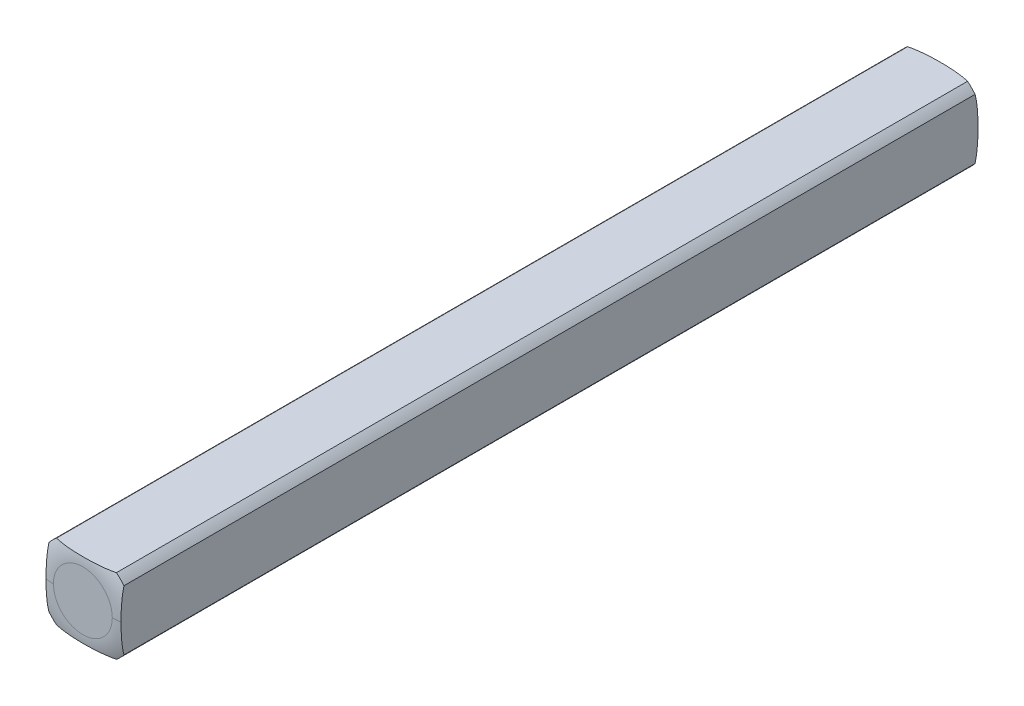
ISO-10303-21;
HEADER;
FILE_DESCRIPTION(('STEP AP214'),'2;1');
FILE_NAME('part.step','',(''),(''),'','','');
FILE_SCHEMA(('AUTOMOTIVE_DESIGN { 1 0 10303 214 1 1 1 1 }'));
ENDSEC;
DATA;
#1=APPLICATION_CONTEXT('core data for automotive mechanical design processes');
#2=APPLICATION_PROTOCOL_DEFINITION('international standard','automotive_design',2000,#1);
#3=PRODUCT_CONTEXT('',#1,'mechanical');
#4=PRODUCT('Part','Part','',(#3));
#5=PRODUCT_RELATED_PRODUCT_CATEGORY('part','',(#4));
#6=PRODUCT_DEFINITION_FORMATION('','',#4);
#7=PRODUCT_DEFINITION_CONTEXT('part definition',#1,'design');
#8=PRODUCT_DEFINITION('design','',#6,#7);
#9=PRODUCT_DEFINITION_SHAPE('','',#8);
#10=(LENGTH_UNIT() NAMED_UNIT(*) SI_UNIT(.MILLI.,.METRE.));
#11=(NAMED_UNIT(*) PLANE_ANGLE_UNIT() SI_UNIT($,.RADIAN.));
#12=(NAMED_UNIT(*) SI_UNIT($,.STERADIAN.) SOLID_ANGLE_UNIT());
#13=UNCERTAINTY_MEASURE_WITH_UNIT(LENGTH_MEASURE(1.E-05),#10,'distance_accuracy_value','');
#14=(GEOMETRIC_REPRESENTATION_CONTEXT(3) GLOBAL_UNCERTAINTY_ASSIGNED_CONTEXT((#13)) GLOBAL_UNIT_ASSIGNED_CONTEXT((#10,
#11,#12)) REPRESENTATION_CONTEXT('',''));
#15=CARTESIAN_POINT('',(0.,0.,0.));
#16=DIRECTION('',(0.,0.,1.));
#17=DIRECTION('',(1.,0.,0.));
#18=AXIS2_PLACEMENT_3D('',#15,#16,#17);
#19=CARTESIAN_POINT('',(0.,0.,-18.161));
#20=DIRECTION('',(0.,0.,1.));
#21=DIRECTION('',(1.,0.,0.));
#22=AXIS2_PLACEMENT_3D('',#19,#20,#21);
#23=CYLINDRICAL_SURFACE('',#22,2.032);
#24=CARTESIAN_POINT('',(0.,0.,-18.009919142098));
#25=DIRECTION('',(0.,0.,1.));
#26=DIRECTION('',(1.,0.,0.));
#27=AXIS2_PLACEMENT_3D('',#24,#25,#26);
#28=CIRCLE('',#27,2.032);
#29=CARTESIAN_POINT('',(-1.26841150657032,1.5875,-18.009919142098));
#30=VERTEX_POINT('',#29);
#31=CARTESIAN_POINT('',(-1.5875,1.26841150657032,-18.009919142098));
#32=VERTEX_POINT('',#31);
#33=EDGE_CURVE('E224',#30,#32,#28,.T.);
#34=ORIENTED_EDGE('',*,*,#33,.T.);
#35=DIRECTION('',(0.,0.,1.));
#36=VECTOR('',#35,1.);
#37=CARTESIAN_POINT('',(-1.5875,1.26841150657032,-18.161));
#38=LINE('',#37,#36);
#39=CARTESIAN_POINT('',(-1.5875,1.26841150657032,18.009919142098));
#40=VERTEX_POINT('',#39);
#41=EDGE_CURVE('E375',#32,#40,#38,.T.);
#42=ORIENTED_EDGE('',*,*,#41,.T.);
#43=CARTESIAN_POINT('',(0.,0.,18.009919142098));
#44=DIRECTION('',(0.,0.,-1.));
#45=DIRECTION('',(-1.,0.,0.));
#46=AXIS2_PLACEMENT_3D('',#43,#44,#45);
#47=CIRCLE('',#46,2.032);
#48=CARTESIAN_POINT('',(-1.26841150657032,1.5875,18.009919142098));
#49=VERTEX_POINT('',#48);
#50=EDGE_CURVE('E9',#40,#49,#47,.T.);
#51=ORIENTED_EDGE('',*,*,#50,.T.);
#52=DIRECTION('',(0.,0.,-1.));
#53=VECTOR('',#52,1.);
#54=CARTESIAN_POINT('',(-1.26841150657032,1.5875,-18.161));
#55=LINE('',#54,#53);
#56=EDGE_CURVE('E523',#49,#30,#55,.T.);
#57=ORIENTED_EDGE('',*,*,#56,.T.);
#58=EDGE_LOOP('',(#34,#42,#51,#57));
#59=FACE_BOUND('',#58,.T.);
#60=ADVANCED_FACE('F15',(#59),#23,.T.);
#61=CARTESIAN_POINT('',(0.,0.,-18.161));
#62=DIRECTION('',(0.,0.,1.));
#63=DIRECTION('',(1.,0.,0.));
#64=AXIS2_PLACEMENT_3D('',#61,#62,#63);
#65=CYLINDRICAL_SURFACE('',#64,2.032);
#66=CARTESIAN_POINT('',(0.,0.,-18.009919142098));
#67=DIRECTION('',(0.,0.,1.));
#68=DIRECTION('',(1.,0.,0.));
#69=AXIS2_PLACEMENT_3D('',#66,#67,#68);
#70=CIRCLE('',#69,2.032);
#71=CARTESIAN_POINT('',(1.5875,1.26841150657032,-18.009919142098));
#72=VERTEX_POINT('',#71);
#73=CARTESIAN_POINT('',(1.26841150657032,1.5875,-18.009919142098));
#74=VERTEX_POINT('',#73);
#75=EDGE_CURVE('E430',#72,#74,#70,.T.);
#76=ORIENTED_EDGE('',*,*,#75,.T.);
#77=DIRECTION('',(0.,0.,1.));
#78=VECTOR('',#77,1.);
#79=CARTESIAN_POINT('',(1.26841150657032,1.5875,-18.161));
#80=LINE('',#79,#78);
#81=CARTESIAN_POINT('',(1.26841150657032,1.5875,18.009919142098));
#82=VERTEX_POINT('',#81);
#83=EDGE_CURVE('E517',#74,#82,#80,.T.);
#84=ORIENTED_EDGE('',*,*,#83,.T.);
#85=CARTESIAN_POINT('',(0.,0.,18.009919142098));
#86=DIRECTION('',(0.,0.,-1.));
#87=DIRECTION('',(-1.,0.,0.));
#88=AXIS2_PLACEMENT_3D('',#85,#86,#87);
#89=CIRCLE('',#88,2.032);
#90=CARTESIAN_POINT('',(1.5875,1.26841150657032,18.009919142098));
#91=VERTEX_POINT('',#90);
#92=EDGE_CURVE('E27',#82,#91,#89,.T.);
#93=ORIENTED_EDGE('',*,*,#92,.T.);
#94=DIRECTION('',(0.,0.,-1.));
#95=VECTOR('',#94,1.);
#96=CARTESIAN_POINT('',(1.5875,1.26841150657032,-18.161));
#97=LINE('',#96,#95);
#98=EDGE_CURVE('E484',#91,#72,#97,.T.);
#99=ORIENTED_EDGE('',*,*,#98,.T.);
#100=EDGE_LOOP('',(#76,#84,#93,#99));
#101=FACE_BOUND('',#100,.T.);
#102=ADVANCED_FACE('F464',(#101),#65,.T.);
#103=CARTESIAN_POINT('',(0.,0.,-18.161));
#104=DIRECTION('',(0.,0.,1.));
#105=DIRECTION('',(1.,0.,0.));
#106=AXIS2_PLACEMENT_3D('',#103,#104,#105);
#107=CYLINDRICAL_SURFACE('',#106,2.032);
#108=CARTESIAN_POINT('',(0.,0.,-18.009919142098));
#109=DIRECTION('',(0.,0.,1.));
#110=DIRECTION('',(1.,0.,0.));
#111=AXIS2_PLACEMENT_3D('',#108,#109,#110);
#112=CIRCLE('',#111,2.032);
#113=CARTESIAN_POINT('',(1.26841150657032,-1.5875,-18.009919142098));
#114=VERTEX_POINT('',#113);
#115=CARTESIAN_POINT('',(1.5875,-1.26841150657032,-18.009919142098));
#116=VERTEX_POINT('',#115);
#117=EDGE_CURVE('E173',#114,#116,#112,.T.);
#118=ORIENTED_EDGE('',*,*,#117,.T.);
#119=DIRECTION('',(0.,0.,1.));
#120=VECTOR('',#119,1.);
#121=CARTESIAN_POINT('',(1.5875,-1.26841150657032,-18.161));
#122=LINE('',#121,#120);
#123=CARTESIAN_POINT('',(1.5875,-1.26841150657032,18.009919142098));
#124=VERTEX_POINT('',#123);
#125=EDGE_CURVE('E348',#116,#124,#122,.T.);
#126=ORIENTED_EDGE('',*,*,#125,.T.);
#127=CARTESIAN_POINT('',(0.,0.,18.009919142098));
#128=DIRECTION('',(0.,0.,-1.));
#129=DIRECTION('',(-1.,0.,0.));
#130=AXIS2_PLACEMENT_3D('',#127,#128,#129);
#131=CIRCLE('',#130,2.032);
#132=CARTESIAN_POINT('',(1.26841150657032,-1.5875,18.009919142098));
#133=VERTEX_POINT('',#132);
#134=EDGE_CURVE('E280',#124,#133,#131,.T.);
#135=ORIENTED_EDGE('',*,*,#134,.T.);
#136=DIRECTION('',(0.,0.,-1.));
#137=VECTOR('',#136,1.);
#138=CARTESIAN_POINT('',(1.26841150657032,-1.5875,-18.161));
#139=LINE('',#138,#137);
#140=EDGE_CURVE('E342',#133,#114,#139,.T.);
#141=ORIENTED_EDGE('',*,*,#140,.T.);
#142=EDGE_LOOP('',(#118,#126,#135,#141));
#143=FACE_BOUND('',#142,.T.);
#144=ADVANCED_FACE('F309',(#143),#107,.T.);
#145=CARTESIAN_POINT('',(0.,0.,-18.161));
#146=DIRECTION('',(0.,0.,1.));
#147=DIRECTION('',(1.,0.,0.));
#148=AXIS2_PLACEMENT_3D('',#145,#146,#147);
#149=CYLINDRICAL_SURFACE('',#148,2.032);
#150=CARTESIAN_POINT('',(0.,0.,-18.009919142098));
#151=DIRECTION('',(0.,0.,1.));
#152=DIRECTION('',(1.,0.,0.));
#153=AXIS2_PLACEMENT_3D('',#150,#151,#152);
#154=CIRCLE('',#153,2.032);
#155=CARTESIAN_POINT('',(-1.5875,-1.26841150657032,-18.009919142098));
#156=VERTEX_POINT('',#155);
#157=CARTESIAN_POINT('',(-1.26841150657032,-1.5875,-18.009919142098));
#158=VERTEX_POINT('',#157);
#159=EDGE_CURVE('E144',#156,#158,#154,.T.);
#160=ORIENTED_EDGE('',*,*,#159,.T.);
#161=DIRECTION('',(0.,0.,1.));
#162=VECTOR('',#161,1.);
#163=CARTESIAN_POINT('',(-1.26841150657032,-1.5875,-18.161));
#164=LINE('',#163,#162);
#165=CARTESIAN_POINT('',(-1.26841150657032,-1.5875,18.009919142098));
#166=VERTEX_POINT('',#165);
#167=EDGE_CURVE('E339',#158,#166,#164,.T.);
#168=ORIENTED_EDGE('',*,*,#167,.T.);
#169=CARTESIAN_POINT('',(0.,0.,18.009919142098));
#170=DIRECTION('',(0.,0.,-1.));
#171=DIRECTION('',(-1.,0.,0.));
#172=AXIS2_PLACEMENT_3D('',#169,#170,#171);
#173=CIRCLE('',#172,2.032);
#174=CARTESIAN_POINT('',(-1.5875,-1.26841150657032,18.009919142098));
#175=VERTEX_POINT('',#174);
#176=EDGE_CURVE('E837',#166,#175,#173,.T.);
#177=ORIENTED_EDGE('',*,*,#176,.T.);
#178=DIRECTION('',(0.,0.,-1.));
#179=VECTOR('',#178,1.);
#180=CARTESIAN_POINT('',(-1.5875,-1.26841150657032,-18.161));
#181=LINE('',#180,#179);
#182=EDGE_CURVE('E404',#175,#156,#181,.T.);
#183=ORIENTED_EDGE('',*,*,#182,.T.);
#184=EDGE_LOOP('',(#160,#168,#177,#183));
#185=FACE_BOUND('',#184,.T.);
#186=ADVANCED_FACE('F465',(#185),#149,.T.);
#187=CARTESIAN_POINT('',(-1.5875,1.5875,18.161));
#188=DIRECTION('',(0.,0.,-1.));
#189=DIRECTION('',(0.,-1.,0.));
#190=AXIS2_PLACEMENT_3D('',#187,#188,#189);
#191=PLANE('',#190);
#192=CARTESIAN_POINT('',(0.,0.,18.161));
#193=DIRECTION('',(0.,0.,1.));
#194=DIRECTION('',(1.,0.,0.));
#195=AXIS2_PLACEMENT_3D('',#192,#193,#194);
#196=CIRCLE('',#195,1.24506403026729);
#197=CARTESIAN_POINT('',(1.24506403026729,0.,18.161));
#198=VERTEX_POINT('',#197);
#199=CARTESIAN_POINT('',(-1.24506403026729,0.,18.161));
#200=VERTEX_POINT('',#199);
#201=EDGE_CURVE('E140',#198,#200,#196,.T.);
#202=ORIENTED_EDGE('',*,*,#201,.T.);
#203=CARTESIAN_POINT('',(0.,0.,18.161));
#204=DIRECTION('',(0.,0.,1.));
#205=DIRECTION('',(1.,0.,0.));
#206=AXIS2_PLACEMENT_3D('',#203,#204,#205);
#207=CIRCLE('',#206,1.24506403026729);
#208=EDGE_CURVE('E141',#200,#198,#207,.T.);
#209=ORIENTED_EDGE('',*,*,#208,.T.);
#210=EDGE_LOOP('',(#202,#209));
#211=FACE_BOUND('',#210,.T.);
#212=ADVANCED_FACE('F136',(#211),#191,.F.);
#213=CARTESIAN_POINT('',(-1.5875,1.5875,-18.161));
#214=DIRECTION('',(0.,0.,-1.));
#215=DIRECTION('',(0.,-1.,0.));
#216=AXIS2_PLACEMENT_3D('',#213,#214,#215);
#217=PLANE('',#216);
#218=CARTESIAN_POINT('',(0.,0.,-18.161));
#219=DIRECTION('',(0.,0.,1.));
#220=DIRECTION('',(1.,0.,0.));
#221=AXIS2_PLACEMENT_3D('',#218,#219,#220);
#222=CIRCLE('',#221,1.24506403026729);
#223=CARTESIAN_POINT('',(1.24506403026729,0.,-18.161));
#224=VERTEX_POINT('',#223);
#225=CARTESIAN_POINT('',(-1.24506403026729,0.,-18.161));
#226=VERTEX_POINT('',#225);
#227=EDGE_CURVE('E170',#224,#226,#222,.T.);
#228=ORIENTED_EDGE('',*,*,#227,.F.);
#229=CARTESIAN_POINT('',(0.,0.,-18.161));
#230=DIRECTION('',(0.,0.,1.));
#231=DIRECTION('',(1.,0.,0.));
#232=AXIS2_PLACEMENT_3D('',#229,#230,#231);
#233=CIRCLE('',#232,1.24506403026729);
#234=EDGE_CURVE('E175',#226,#224,#233,.T.);
#235=ORIENTED_EDGE('',*,*,#234,.F.);
#236=EDGE_LOOP('',(#228,#235));
#237=FACE_BOUND('',#236,.T.);
#238=ADVANCED_FACE('F455',(#237),#217,.T.);
#239=CARTESIAN_POINT('',(0.,0.,16.036));
#240=DIRECTION('',(0.,0.,-1.));
#241=DIRECTION('',(1.,0.,0.));
#242=AXIS2_PLACEMENT_3D('',#239,#240,#241);
#243=DEGENERATE_TOROIDAL_SURFACE('',#242,1.24506403026729,2.125,.T.);
#244=CARTESIAN_POINT('',(-1.24506403026729,0.,16.036));
#245=DIRECTION('',(0.,-1.,0.));
#246=DIRECTION('',(1.,0.,0.));
#247=AXIS2_PLACEMENT_3D('',#244,#245,#246);
#248=CIRCLE('',#247,2.125);
#249=CARTESIAN_POINT('',(-1.5875,0.,18.1332273616928));
#250=VERTEX_POINT('',#249);
#251=EDGE_CURVE('E150',#200,#250,#248,.T.);
#252=ORIENTED_EDGE('',*,*,#251,.F.);
#253=ORIENTED_EDGE('',*,*,#201,.F.);
#254=CARTESIAN_POINT('',(1.24506403026729,0.,16.036));
#255=DIRECTION('',(0.,1.,0.));
#256=DIRECTION('',(0.,0.,1.));
#257=AXIS2_PLACEMENT_3D('',#254,#255,#256);
#258=CIRCLE('',#257,2.125);
#259=CARTESIAN_POINT('',(1.5875,0.,18.1332273616928));
#260=VERTEX_POINT('',#259);
#261=EDGE_CURVE('E161',#198,#260,#258,.T.);
#262=ORIENTED_EDGE('',*,*,#261,.T.);
#263=CARTESIAN_POINT('',(1.5875,1.26841150657033,18.009919142098));
#264=CARTESIAN_POINT('',(1.5875,0.98707709493512,18.0799306391293));
#265=CARTESIAN_POINT('',(1.5875,0.63953045901757,18.1091819538896));
#266=CARTESIAN_POINT('',(1.5875,0.353837297539495,18.1332273616929));
#267=CARTESIAN_POINT('',(1.5875,0.,18.1332273616929));
#268=B_SPLINE_CURVE_WITH_KNOTS('',2,(#263,#264,#265,#266,#267),.UNSPECIFIED.,.F.,.F.,(3,2,3),
(0.,0.5,1.),.UNSPECIFIED.);
#269=EDGE_CURVE('E518',#91,#260,#268,.T.);
#270=ORIENTED_EDGE('',*,*,#269,.F.);
#271=ORIENTED_EDGE('',*,*,#92,.F.);
#272=CARTESIAN_POINT('',(-1.26841150657032,1.5875,18.009919142098));
#273=CARTESIAN_POINT('',(-0.770338232190304,1.5875,18.1338672057847));
#274=CARTESIAN_POINT('',(0.00849337593367507,1.5875,18.1332236517902));
#275=CARTESIAN_POINT('',(0.775470990418355,1.5875,18.1325898928334));
#276=CARTESIAN_POINT('',(1.26841150657033,1.5875,18.009919142098));
#277=B_SPLINE_CURVE_WITH_KNOTS('',2,(#272,#273,#274,#275,#276),.UNSPECIFIED.,.F.,.F.,(3,2,3),
(0.,0.5,1.),.UNSPECIFIED.);
#278=EDGE_CURVE('E174',#49,#82,#277,.T.);
#279=ORIENTED_EDGE('',*,*,#278,.F.);
#280=ORIENTED_EDGE('',*,*,#50,.F.);
#281=CARTESIAN_POINT('',(-1.5875,0.,18.1332273616929));
#282=CARTESIAN_POINT('',(-1.5875,0.35317995738125,18.1332273616929));
#283=CARTESIAN_POINT('',(-1.5875,0.6395293222865,18.1091820494506));
#284=CARTESIAN_POINT('',(-1.5875,0.98666984323238,18.0800319857833));
#285=CARTESIAN_POINT('',(-1.5875,1.26841150657033,18.009919142098));
#286=B_SPLINE_CURVE_WITH_KNOTS('',2,(#281,#282,#283,#284,#285),.UNSPECIFIED.,.F.,.F.,(3,2,3),
(0.,0.5,1.),.UNSPECIFIED.);
#287=EDGE_CURVE('E153',#250,#40,#286,.T.);
#288=ORIENTED_EDGE('',*,*,#287,.F.);
#289=EDGE_LOOP('',(#252,#253,#262,#270,#271,#279,#280,#288));
#290=FACE_BOUND('',#289,.T.);
#291=ADVANCED_FACE('F146',(#290),#243,.T.);
#292=CARTESIAN_POINT('',(0.,0.,-16.036));
#293=DIRECTION('',(0.,0.,1.));
#294=DIRECTION('',(1.,0.,0.));
#295=AXIS2_PLACEMENT_3D('',#292,#293,#294);
#296=DEGENERATE_TOROIDAL_SURFACE('',#295,1.24506403026729,2.125,.T.);
#297=CARTESIAN_POINT('',(-1.24506403026729,0.,-16.036));
#298=DIRECTION('',(0.,1.,0.));
#299=DIRECTION('',(-1.,0.,0.));
#300=AXIS2_PLACEMENT_3D('',#297,#298,#299);
#301=CIRCLE('',#300,2.125);
#302=CARTESIAN_POINT('',(-1.5875,0.,-18.1332273616928));
#303=VERTEX_POINT('',#302);
#304=EDGE_CURVE('E171',#226,#303,#301,.T.);
#305=ORIENTED_EDGE('',*,*,#304,.F.);
#306=ORIENTED_EDGE('',*,*,#234,.T.);
#307=CARTESIAN_POINT('',(1.24506403026729,0.,-16.036));
#308=DIRECTION('',(0.,-1.,0.));
#309=DIRECTION('',(0.,0.,-1.));
#310=AXIS2_PLACEMENT_3D('',#307,#308,#309);
#311=CIRCLE('',#310,2.125);
#312=CARTESIAN_POINT('',(1.5875,0.,-18.1332273616928));
#313=VERTEX_POINT('',#312);
#314=EDGE_CURVE('E374',#224,#313,#311,.T.);
#315=ORIENTED_EDGE('',*,*,#314,.T.);
#316=CARTESIAN_POINT('',(1.5875,-1.26841150657032,-18.009919142098));
#317=CARTESIAN_POINT('',(1.5875,-0.987077094928346,-18.079930639131));
#318=CARTESIAN_POINT('',(1.5875,-0.639530459017567,-18.1091819538896));
#319=CARTESIAN_POINT('',(1.5875,-0.353837297528486,-18.1332273616929));
#320=CARTESIAN_POINT('',(1.5875,0.,-18.1332273616929));
#321=B_SPLINE_CURVE_WITH_KNOTS('',2,(#316,#317,#318,#319,#320),.UNSPECIFIED.,.F.,.F.,(3,2,3),
(0.,0.5,1.),.UNSPECIFIED.);
#322=EDGE_CURVE('E476',#116,#313,#321,.T.);
#323=ORIENTED_EDGE('',*,*,#322,.F.);
#324=ORIENTED_EDGE('',*,*,#117,.F.);
#325=CARTESIAN_POINT('',(-1.26841150657032,-1.5875,-18.009919142098));
#326=CARTESIAN_POINT('',(-0.770338232200882,-1.5875,-18.1338672057821));
#327=CARTESIAN_POINT('',(0.00849337593367507,-1.5875,-18.1332236517903));
#328=CARTESIAN_POINT('',(0.775470990407846,-1.5875,-18.132589892836));
#329=CARTESIAN_POINT('',(1.26841150657033,-1.5875,-18.009919142098));
#330=B_SPLINE_CURVE_WITH_KNOTS('',2,(#325,#326,#327,#328,#329),.UNSPECIFIED.,.F.,.F.,(3,2,3),
(0.,0.5,1.),.UNSPECIFIED.);
#331=EDGE_CURVE('E327',#158,#114,#330,.T.);
#332=ORIENTED_EDGE('',*,*,#331,.F.);
#333=ORIENTED_EDGE('',*,*,#159,.F.);
#334=CARTESIAN_POINT('',(-1.5875,0.,-18.1332273616929));
#335=CARTESIAN_POINT('',(-1.5875,-0.353179957391938,-18.1332273616929));
#336=CARTESIAN_POINT('',(-1.5875,-0.639529322286499,-18.1091820494506));
#337=CARTESIAN_POINT('',(-1.5875,-0.986669843239049,-18.0800319857817));
#338=CARTESIAN_POINT('',(-1.5875,-1.26841150657032,-18.009919142098));
#339=B_SPLINE_CURVE_WITH_KNOTS('',2,(#334,#335,#336,#337,#338),.UNSPECIFIED.,.F.,.F.,(3,2,3),
(0.,0.5,1.),.UNSPECIFIED.);
#340=EDGE_CURVE('E372',#303,#156,#339,.T.);
#341=ORIENTED_EDGE('',*,*,#340,.F.);
#342=EDGE_LOOP('',(#305,#306,#315,#323,#324,#332,#333,#341));
#343=FACE_BOUND('',#342,.T.);
#344=ADVANCED_FACE('F200',(#343),#296,.T.);
#345=CARTESIAN_POINT('',(-1.5875,1.5875,18.161));
#346=DIRECTION('',(0.,-1.,0.));
#347=DIRECTION('',(0.,0.,-1.));
#348=AXIS2_PLACEMENT_3D('',#345,#346,#347);
#349=PLANE('',#348);
#350=ORIENTED_EDGE('',*,*,#83,.F.);
#351=CARTESIAN_POINT('',(1.26841150657033,1.5875,-18.009919142098));
#352=CARTESIAN_POINT('',(0.770338232200885,1.5875,-18.1338672057821));
#353=CARTESIAN_POINT('',(-0.00849337593367486,1.5875,-18.1332236517903));
#354=CARTESIAN_POINT('',(-0.775470990407842,1.5875,-18.132589892836));
#355=CARTESIAN_POINT('',(-1.26841150657032,1.5875,-18.009919142098));
#356=B_SPLINE_CURVE_WITH_KNOTS('',2,(#351,#352,#353,#354,#355),.UNSPECIFIED.,.F.,.F.,(3,2,3),
(0.,0.5,1.),.UNSPECIFIED.);
#357=EDGE_CURVE('E217',#74,#30,#356,.T.);
#358=ORIENTED_EDGE('',*,*,#357,.T.);
#359=ORIENTED_EDGE('',*,*,#56,.F.);
#360=ORIENTED_EDGE('',*,*,#278,.T.);
#361=EDGE_LOOP('',(#350,#358,#359,#360));
#362=FACE_BOUND('',#361,.T.);
#363=ADVANCED_FACE('F187',(#362),#349,.F.);
#364=CARTESIAN_POINT('',(1.5875,-1.5875,18.161));
#365=DIRECTION('',(-1.,0.,0.));
#366=DIRECTION('',(0.,0.,1.));
#367=AXIS2_PLACEMENT_3D('',#364,#365,#366);
#368=PLANE('',#367);
#369=ORIENTED_EDGE('',*,*,#125,.F.);
#370=ORIENTED_EDGE('',*,*,#322,.T.);
#371=CARTESIAN_POINT('',(1.5875,0.,-18.1332273616929));
#372=CARTESIAN_POINT('',(1.5875,0.35317995739205,-18.1332273616929));
#373=CARTESIAN_POINT('',(1.5875,0.6395293222865,-18.1091820494506));
#374=CARTESIAN_POINT('',(1.5875,0.98666984323912,-18.0800319857817));
#375=CARTESIAN_POINT('',(1.5875,1.26841150657033,-18.009919142098));
#376=B_SPLINE_CURVE_WITH_KNOTS('',2,(#371,#372,#373,#374,#375),.UNSPECIFIED.,.F.,.F.,(3,2,3),
(0.,0.5,1.),.UNSPECIFIED.);
#377=EDGE_CURVE('E414',#313,#72,#376,.T.);
#378=ORIENTED_EDGE('',*,*,#377,.T.);
#379=ORIENTED_EDGE('',*,*,#98,.F.);
#380=ORIENTED_EDGE('',*,*,#269,.T.);
#381=CARTESIAN_POINT('',(1.5875,0.,18.1332273616929));
#382=CARTESIAN_POINT('',(1.5875,-0.353179957370336,18.1332273616929));
#383=CARTESIAN_POINT('',(1.5875,-0.639529322286499,18.1091820494506));
#384=CARTESIAN_POINT('',(1.5875,-0.986669843225547,18.080031985785));
#385=CARTESIAN_POINT('',(1.5875,-1.26841150657032,18.009919142098));
#386=B_SPLINE_CURVE_WITH_KNOTS('',2,(#381,#382,#383,#384,#385),.UNSPECIFIED.,.F.,.F.,(3,2,3),
(0.,0.5,1.),.UNSPECIFIED.);
#387=EDGE_CURVE('E262',#260,#124,#386,.T.);
#388=ORIENTED_EDGE('',*,*,#387,.T.);
#389=EDGE_LOOP('',(#369,#370,#378,#379,#380,#388));
#390=FACE_BOUND('',#389,.T.);
#391=ADVANCED_FACE('F197',(#390),#368,.F.);
#392=CARTESIAN_POINT('',(-1.5875,-1.5875,18.161));
#393=DIRECTION('',(0.,1.,0.));
#394=DIRECTION('',(1.,0.,0.));
#395=AXIS2_PLACEMENT_3D('',#392,#393,#394);
#396=PLANE('',#395);
#397=ORIENTED_EDGE('',*,*,#167,.F.);
#398=ORIENTED_EDGE('',*,*,#331,.T.);
#399=ORIENTED_EDGE('',*,*,#140,.F.);
#400=CARTESIAN_POINT('',(1.26841150657033,-1.5875,18.009919142098));
#401=CARTESIAN_POINT('',(0.770338232190305,-1.5875,18.1338672057847));
#402=CARTESIAN_POINT('',(-0.00849337593367486,-1.5875,18.1332236517902));
#403=CARTESIAN_POINT('',(-0.775470990418356,-1.5875,18.1325898928334));
#404=CARTESIAN_POINT('',(-1.26841150657032,-1.5875,18.009919142098));
#405=B_SPLINE_CURVE_WITH_KNOTS('',2,(#400,#401,#402,#403,#404),.UNSPECIFIED.,.F.,.F.,(3,2,3),
(0.,0.5,1.),.UNSPECIFIED.);
#406=EDGE_CURVE('E286',#133,#166,#405,.T.);
#407=ORIENTED_EDGE('',*,*,#406,.T.);
#408=EDGE_LOOP('',(#397,#398,#399,#407));
#409=FACE_BOUND('',#408,.T.);
#410=ADVANCED_FACE('F298',(#409),#396,.F.);
#411=CARTESIAN_POINT('',(-1.5875,-1.5875,18.161));
#412=DIRECTION('',(1.,0.,0.));
#413=DIRECTION('',(0.,1.,0.));
#414=AXIS2_PLACEMENT_3D('',#411,#412,#413);
#415=PLANE('',#414);
#416=ORIENTED_EDGE('',*,*,#41,.F.);
#417=CARTESIAN_POINT('',(-1.5875,1.26841150657033,-18.009919142098));
#418=CARTESIAN_POINT('',(-1.5875,0.987077094928345,-18.079930639131));
#419=CARTESIAN_POINT('',(-1.5875,0.63953045901757,-18.1091819538896));
#420=CARTESIAN_POINT('',(-1.5875,0.353837297528485,-18.1332273616929));
#421=CARTESIAN_POINT('',(-1.5875,0.,-18.1332273616929));
#422=B_SPLINE_CURVE_WITH_KNOTS('',2,(#417,#418,#419,#420,#421),.UNSPECIFIED.,.F.,.F.,(3,2,3),
(0.,0.5,1.),.UNSPECIFIED.);
#423=EDGE_CURVE('E405',#32,#303,#422,.T.);
#424=ORIENTED_EDGE('',*,*,#423,.T.);
#425=ORIENTED_EDGE('',*,*,#340,.T.);
#426=ORIENTED_EDGE('',*,*,#182,.F.);
#427=CARTESIAN_POINT('',(-1.5875,-1.26841150657032,18.009919142098));
#428=CARTESIAN_POINT('',(-1.5875,-0.987077094935117,18.0799306391293));
#429=CARTESIAN_POINT('',(-1.5875,-0.639530459017567,18.1091819538896));
#430=CARTESIAN_POINT('',(-1.5875,-0.353837297539494,18.1332273616929));
#431=CARTESIAN_POINT('',(-1.5875,0.,18.1332273616929));
#432=B_SPLINE_CURVE_WITH_KNOTS('',2,(#427,#428,#429,#430,#431),.UNSPECIFIED.,.F.,.F.,(3,2,3),
(0.,0.5,1.),.UNSPECIFIED.);
#433=EDGE_CURVE('E160',#175,#250,#432,.T.);
#434=ORIENTED_EDGE('',*,*,#433,.T.);
#435=ORIENTED_EDGE('',*,*,#287,.T.);
#436=EDGE_LOOP('',(#416,#424,#425,#426,#434,#435));
#437=FACE_BOUND('',#436,.T.);
#438=ADVANCED_FACE('F237',(#437),#415,.F.);
#439=CARTESIAN_POINT('',(0.,0.,-16.036));
#440=DIRECTION('',(0.,0.,1.));
#441=DIRECTION('',(1.,0.,0.));
#442=AXIS2_PLACEMENT_3D('',#439,#440,#441);
#443=DEGENERATE_TOROIDAL_SURFACE('',#442,1.24506403026729,2.125,.T.);
#444=ORIENTED_EDGE('',*,*,#227,.T.);
#445=ORIENTED_EDGE('',*,*,#304,.T.);
#446=ORIENTED_EDGE('',*,*,#423,.F.);
#447=ORIENTED_EDGE('',*,*,#33,.F.);
#448=ORIENTED_EDGE('',*,*,#357,.F.);
#449=ORIENTED_EDGE('',*,*,#75,.F.);
#450=ORIENTED_EDGE('',*,*,#377,.F.);
#451=ORIENTED_EDGE('',*,*,#314,.F.);
#452=EDGE_LOOP('',(#444,#445,#446,#447,#448,#449,#450,#451));
#453=FACE_BOUND('',#452,.T.);
#454=ADVANCED_FACE('F230',(#453),#443,.T.);
#455=CARTESIAN_POINT('',(0.,0.,16.036));
#456=DIRECTION('',(0.,0.,-1.));
#457=DIRECTION('',(1.,0.,0.));
#458=AXIS2_PLACEMENT_3D('',#455,#456,#457);
#459=DEGENERATE_TOROIDAL_SURFACE('',#458,1.24506403026729,2.125,.T.);
#460=ORIENTED_EDGE('',*,*,#208,.F.);
#461=ORIENTED_EDGE('',*,*,#251,.T.);
#462=ORIENTED_EDGE('',*,*,#433,.F.);
#463=ORIENTED_EDGE('',*,*,#176,.F.);
#464=ORIENTED_EDGE('',*,*,#406,.F.);
#465=ORIENTED_EDGE('',*,*,#134,.F.);
#466=ORIENTED_EDGE('',*,*,#387,.F.);
#467=ORIENTED_EDGE('',*,*,#261,.F.);
#468=EDGE_LOOP('',(#460,#461,#462,#463,#464,#465,#466,#467));
#469=FACE_BOUND('',#468,.T.);
#470=ADVANCED_FACE('F159',(#469),#459,.T.);
#471=CLOSED_SHELL('',(#60,#102,#144,#186,#212,#238,#291,#344,#363,#391,#410,#438,#454,#470));
#472=MANIFOLD_SOLID_BREP('B1',#471);
#473=ADVANCED_BREP_SHAPE_REPRESENTATION('',(#18,#472),#14);
#474=SHAPE_DEFINITION_REPRESENTATION(#9,#473);
ENDSEC;
END-ISO-10303-21;
